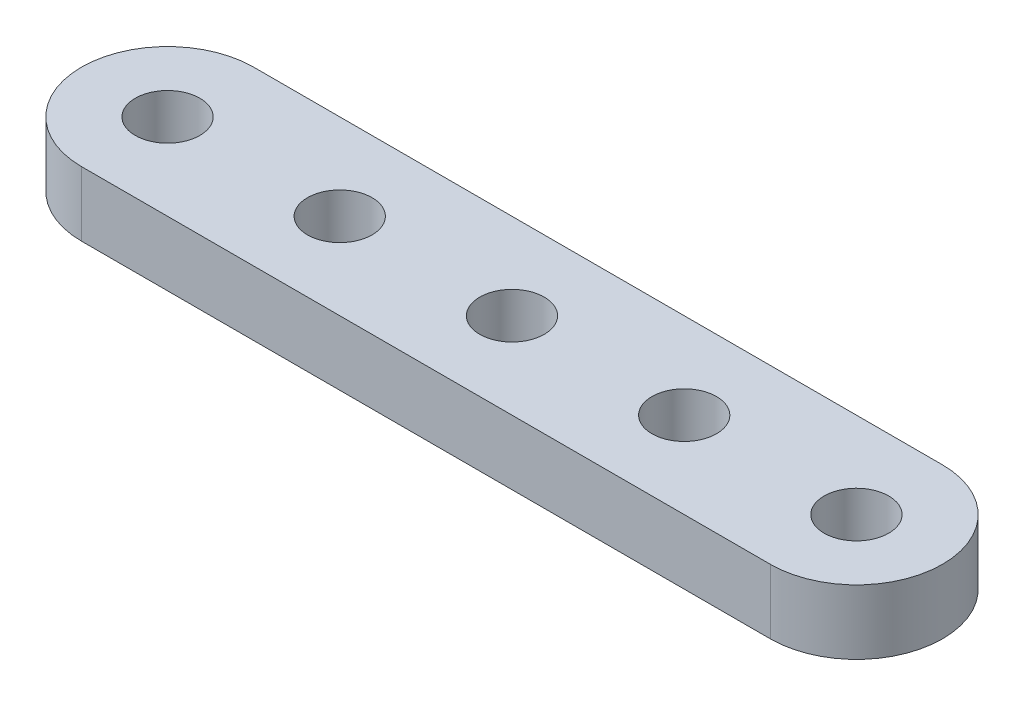
ISO-10303-21;
HEADER;
FILE_DESCRIPTION(('STEP AP214'),'2;1');
FILE_NAME('part.step','',(''),(''),'','','');
FILE_SCHEMA(('AUTOMOTIVE_DESIGN { 1 0 10303 214 1 1 1 1 }'));
ENDSEC;
DATA;
#1=APPLICATION_CONTEXT('core data for automotive mechanical design processes');
#2=APPLICATION_PROTOCOL_DEFINITION('international standard','automotive_design',2000,#1);
#3=PRODUCT_CONTEXT('',#1,'mechanical');
#4=PRODUCT('Part','Part','',(#3));
#5=PRODUCT_RELATED_PRODUCT_CATEGORY('part','',(#4));
#6=PRODUCT_DEFINITION_FORMATION('','',#4);
#7=PRODUCT_DEFINITION_CONTEXT('part definition',#1,'design');
#8=PRODUCT_DEFINITION('design','',#6,#7);
#9=PRODUCT_DEFINITION_SHAPE('','',#8);
#10=(LENGTH_UNIT() NAMED_UNIT(*) SI_UNIT(.MILLI.,.METRE.));
#11=(NAMED_UNIT(*) PLANE_ANGLE_UNIT() SI_UNIT($,.RADIAN.));
#12=(NAMED_UNIT(*) SI_UNIT($,.STERADIAN.) SOLID_ANGLE_UNIT());
#13=UNCERTAINTY_MEASURE_WITH_UNIT(LENGTH_MEASURE(1.E-05),#10,'distance_accuracy_value','');
#14=(GEOMETRIC_REPRESENTATION_CONTEXT(3) GLOBAL_UNCERTAINTY_ASSIGNED_CONTEXT((#13)) GLOBAL_UNIT_ASSIGNED_CONTEXT((#10,
#11,#12)) REPRESENTATION_CONTEXT('',''));
#15=CARTESIAN_POINT('',(0.,0.,0.));
#16=DIRECTION('',(0.,0.,1.));
#17=DIRECTION('',(1.,0.,0.));
#18=AXIS2_PLACEMENT_3D('',#15,#16,#17);
#19=CARTESIAN_POINT('',(0.,3.,0.));
#20=DIRECTION('',(0.,1.,0.));
#21=DIRECTION('',(0.,0.,1.));
#22=AXIS2_PLACEMENT_3D('',#19,#20,#21);
#23=PLANE('',#22);
#24=CARTESIAN_POINT('',(24.,3.,0.));
#25=DIRECTION('',(0.,1.,0.));
#26=DIRECTION('',(0.,0.,1.));
#27=AXIS2_PLACEMENT_3D('',#24,#25,#26);
#28=CIRCLE('',#27,1.5);
#29=CARTESIAN_POINT('',(24.,3.,1.5));
#30=VERTEX_POINT('',#29);
#31=EDGE_CURVE('E128',#30,#30,#28,.T.);
#32=ORIENTED_EDGE('',*,*,#31,.F.);
#33=EDGE_LOOP('',(#32));
#34=FACE_BOUND('',#33,.T.);
#35=CARTESIAN_POINT('',(7.99999999999999,3.,0.));
#36=DIRECTION('',(0.,1.,0.));
#37=DIRECTION('',(0.,0.,1.));
#38=AXIS2_PLACEMENT_3D('',#35,#36,#37);
#39=CIRCLE('',#38,1.5);
#40=CARTESIAN_POINT('',(7.99999999999999,3.,1.5));
#41=VERTEX_POINT('',#40);
#42=EDGE_CURVE('E116',#41,#41,#39,.T.);
#43=ORIENTED_EDGE('',*,*,#42,.F.);
#44=EDGE_LOOP('',(#43));
#45=FACE_BOUND('',#44,.T.);
#46=CARTESIAN_POINT('',(0.,3.,0.));
#47=DIRECTION('',(0.,1.,0.));
#48=DIRECTION('',(0.,0.,1.));
#49=AXIS2_PLACEMENT_3D('',#46,#47,#48);
#50=CIRCLE('',#49,4.);
#51=CARTESIAN_POINT('',(0.,3.,-4.));
#52=VERTEX_POINT('',#51);
#53=CARTESIAN_POINT('',(0.,3.,4.));
#54=VERTEX_POINT('',#53);
#55=EDGE_CURVE('E86',#52,#54,#50,.T.);
#56=ORIENTED_EDGE('',*,*,#55,.T.);
#57=DIRECTION('',(1.,0.,0.));
#58=VECTOR('',#57,1.);
#59=CARTESIAN_POINT('',(0.,3.,4.));
#60=LINE('',#59,#58);
#61=CARTESIAN_POINT('',(32.,3.,4.));
#62=VERTEX_POINT('',#61);
#63=EDGE_CURVE('E81',#54,#62,#60,.T.);
#64=ORIENTED_EDGE('',*,*,#63,.T.);
#65=CARTESIAN_POINT('',(32.,3.,0.));
#66=DIRECTION('',(0.,1.,0.));
#67=DIRECTION('',(0.,0.,1.));
#68=AXIS2_PLACEMENT_3D('',#65,#66,#67);
#69=CIRCLE('',#68,4.);
#70=CARTESIAN_POINT('',(32.,3.,-4.));
#71=VERTEX_POINT('',#70);
#72=EDGE_CURVE('E84',#62,#71,#69,.T.);
#73=ORIENTED_EDGE('',*,*,#72,.T.);
#74=DIRECTION('',(-1.,0.,0.));
#75=VECTOR('',#74,1.);
#76=CARTESIAN_POINT('',(0.,3.,-4.));
#77=LINE('',#76,#75);
#78=EDGE_CURVE('E51',#71,#52,#77,.T.);
#79=ORIENTED_EDGE('',*,*,#78,.T.);
#80=EDGE_LOOP('',(#56,#64,#73,#79));
#81=FACE_BOUND('',#80,.T.);
#82=CARTESIAN_POINT('',(0.,3.,0.));
#83=DIRECTION('',(0.,1.,0.));
#84=DIRECTION('',(0.,0.,1.));
#85=AXIS2_PLACEMENT_3D('',#82,#83,#84);
#86=CIRCLE('',#85,1.5);
#87=CARTESIAN_POINT('',(0.,3.,1.5));
#88=VERTEX_POINT('',#87);
#89=EDGE_CURVE('E101',#88,#88,#86,.T.);
#90=ORIENTED_EDGE('',*,*,#89,.F.);
#91=EDGE_LOOP('',(#90));
#92=FACE_BOUND('',#91,.T.);
#93=CARTESIAN_POINT('',(16.,3.,0.));
#94=DIRECTION('',(0.,1.,0.));
#95=DIRECTION('',(0.,0.,1.));
#96=AXIS2_PLACEMENT_3D('',#93,#94,#95);
#97=CIRCLE('',#96,1.5);
#98=CARTESIAN_POINT('',(16.,3.,1.5));
#99=VERTEX_POINT('',#98);
#100=EDGE_CURVE('E122',#99,#99,#97,.T.);
#101=ORIENTED_EDGE('',*,*,#100,.F.);
#102=EDGE_LOOP('',(#101));
#103=FACE_BOUND('',#102,.T.);
#104=CARTESIAN_POINT('',(32.,3.,0.));
#105=DIRECTION('',(0.,1.,0.));
#106=DIRECTION('',(0.,0.,1.));
#107=AXIS2_PLACEMENT_3D('',#104,#105,#106);
#108=CIRCLE('',#107,1.5);
#109=CARTESIAN_POINT('',(32.,3.,1.5));
#110=VERTEX_POINT('',#109);
#111=EDGE_CURVE('E134',#110,#110,#108,.T.);
#112=ORIENTED_EDGE('',*,*,#111,.F.);
#113=EDGE_LOOP('',(#112));
#114=FACE_BOUND('',#113,.T.);
#115=ADVANCED_FACE('F34',(#34,#45,#81,#92,#103,#114),#23,.T.);
#116=CARTESIAN_POINT('',(0.,0.,0.));
#117=DIRECTION('',(0.,1.,0.));
#118=DIRECTION('',(0.,0.,1.));
#119=AXIS2_PLACEMENT_3D('',#116,#117,#118);
#120=PLANE('',#119);
#121=CARTESIAN_POINT('',(24.,0.,0.));
#122=DIRECTION('',(0.,1.,0.));
#123=DIRECTION('',(0.,0.,1.));
#124=AXIS2_PLACEMENT_3D('',#121,#122,#123);
#125=CIRCLE('',#124,1.5);
#126=CARTESIAN_POINT('',(24.,0.,1.5));
#127=VERTEX_POINT('',#126);
#128=EDGE_CURVE('E131',#127,#127,#125,.T.);
#129=ORIENTED_EDGE('',*,*,#128,.T.);
#130=EDGE_LOOP('',(#129));
#131=FACE_BOUND('',#130,.T.);
#132=CARTESIAN_POINT('',(7.99999999999999,0.,0.));
#133=DIRECTION('',(0.,1.,0.));
#134=DIRECTION('',(0.,0.,1.));
#135=AXIS2_PLACEMENT_3D('',#132,#133,#134);
#136=CIRCLE('',#135,1.5);
#137=CARTESIAN_POINT('',(7.99999999999999,0.,1.5));
#138=VERTEX_POINT('',#137);
#139=EDGE_CURVE('E119',#138,#138,#136,.T.);
#140=ORIENTED_EDGE('',*,*,#139,.T.);
#141=EDGE_LOOP('',(#140));
#142=FACE_BOUND('',#141,.T.);
#143=CARTESIAN_POINT('',(0.,0.,0.));
#144=DIRECTION('',(0.,1.,0.));
#145=DIRECTION('',(0.,0.,1.));
#146=AXIS2_PLACEMENT_3D('',#143,#144,#145);
#147=CIRCLE('',#146,4.);
#148=CARTESIAN_POINT('',(0.,0.,-4.));
#149=VERTEX_POINT('',#148);
#150=CARTESIAN_POINT('',(0.,0.,4.));
#151=VERTEX_POINT('',#150);
#152=EDGE_CURVE('E98',#149,#151,#147,.T.);
#153=ORIENTED_EDGE('',*,*,#152,.F.);
#154=DIRECTION('',(-1.,0.,0.));
#155=VECTOR('',#154,1.);
#156=CARTESIAN_POINT('',(0.,0.,-4.));
#157=LINE('',#156,#155);
#158=CARTESIAN_POINT('',(32.,0.,-4.));
#159=VERTEX_POINT('',#158);
#160=EDGE_CURVE('E74',#159,#149,#157,.T.);
#161=ORIENTED_EDGE('',*,*,#160,.F.);
#162=CARTESIAN_POINT('',(32.,0.,0.));
#163=DIRECTION('',(0.,1.,0.));
#164=DIRECTION('',(0.,0.,1.));
#165=AXIS2_PLACEMENT_3D('',#162,#163,#164);
#166=CIRCLE('',#165,4.);
#167=CARTESIAN_POINT('',(32.,0.,4.));
#168=VERTEX_POINT('',#167);
#169=EDGE_CURVE('E68',#168,#159,#166,.T.);
#170=ORIENTED_EDGE('',*,*,#169,.F.);
#171=DIRECTION('',(1.,0.,0.));
#172=VECTOR('',#171,1.);
#173=CARTESIAN_POINT('',(0.,0.,4.));
#174=LINE('',#173,#172);
#175=EDGE_CURVE('E90',#151,#168,#174,.T.);
#176=ORIENTED_EDGE('',*,*,#175,.F.);
#177=EDGE_LOOP('',(#153,#161,#170,#176));
#178=FACE_BOUND('',#177,.T.);
#179=CARTESIAN_POINT('',(0.,0.,0.));
#180=DIRECTION('',(0.,1.,0.));
#181=DIRECTION('',(0.,0.,1.));
#182=AXIS2_PLACEMENT_3D('',#179,#180,#181);
#183=CIRCLE('',#182,1.5);
#184=CARTESIAN_POINT('',(0.,0.,1.5));
#185=VERTEX_POINT('',#184);
#186=EDGE_CURVE('E113',#185,#185,#183,.T.);
#187=ORIENTED_EDGE('',*,*,#186,.T.);
#188=EDGE_LOOP('',(#187));
#189=FACE_BOUND('',#188,.T.);
#190=CARTESIAN_POINT('',(16.,0.,0.));
#191=DIRECTION('',(0.,1.,0.));
#192=DIRECTION('',(0.,0.,1.));
#193=AXIS2_PLACEMENT_3D('',#190,#191,#192);
#194=CIRCLE('',#193,1.5);
#195=CARTESIAN_POINT('',(16.,0.,1.5));
#196=VERTEX_POINT('',#195);
#197=EDGE_CURVE('E125',#196,#196,#194,.T.);
#198=ORIENTED_EDGE('',*,*,#197,.T.);
#199=EDGE_LOOP('',(#198));
#200=FACE_BOUND('',#199,.T.);
#201=CARTESIAN_POINT('',(32.,0.,0.));
#202=DIRECTION('',(0.,1.,0.));
#203=DIRECTION('',(0.,0.,1.));
#204=AXIS2_PLACEMENT_3D('',#201,#202,#203);
#205=CIRCLE('',#204,1.5);
#206=CARTESIAN_POINT('',(32.,0.,1.5));
#207=VERTEX_POINT('',#206);
#208=EDGE_CURVE('E137',#207,#207,#205,.T.);
#209=ORIENTED_EDGE('',*,*,#208,.T.);
#210=EDGE_LOOP('',(#209));
#211=FACE_BOUND('',#210,.T.);
#212=ADVANCED_FACE('F109',(#131,#142,#178,#189,#200,#211),#120,.F.);
#213=CARTESIAN_POINT('',(0.,3.,0.));
#214=DIRECTION('',(0.,-1.,0.));
#215=DIRECTION('',(0.,0.,-1.));
#216=AXIS2_PLACEMENT_3D('',#213,#214,#215);
#217=CYLINDRICAL_SURFACE('',#216,4.);
#218=ORIENTED_EDGE('',*,*,#152,.T.);
#219=DIRECTION('',(0.,-1.,0.));
#220=VECTOR('',#219,1.);
#221=CARTESIAN_POINT('',(0.,3.,4.));
#222=LINE('',#221,#220);
#223=EDGE_CURVE('E11',#54,#151,#222,.T.);
#224=ORIENTED_EDGE('',*,*,#223,.F.);
#225=ORIENTED_EDGE('',*,*,#55,.F.);
#226=DIRECTION('',(0.,-1.,0.));
#227=VECTOR('',#226,1.);
#228=CARTESIAN_POINT('',(0.,3.,-4.));
#229=LINE('',#228,#227);
#230=EDGE_CURVE('E94',#52,#149,#229,.T.);
#231=ORIENTED_EDGE('',*,*,#230,.T.);
#232=EDGE_LOOP('',(#218,#224,#225,#231));
#233=FACE_BOUND('',#232,.T.);
#234=ADVANCED_FACE('F36',(#233),#217,.T.);
#235=CARTESIAN_POINT('',(0.,3.,4.));
#236=DIRECTION('',(0.,0.,-1.));
#237=DIRECTION('',(-1.,0.,0.));
#238=AXIS2_PLACEMENT_3D('',#235,#236,#237);
#239=PLANE('',#238);
#240=ORIENTED_EDGE('',*,*,#175,.T.);
#241=DIRECTION('',(0.,-1.,0.));
#242=VECTOR('',#241,1.);
#243=CARTESIAN_POINT('',(32.,3.,4.));
#244=LINE('',#243,#242);
#245=EDGE_CURVE('E43',#62,#168,#244,.T.);
#246=ORIENTED_EDGE('',*,*,#245,.F.);
#247=ORIENTED_EDGE('',*,*,#63,.F.);
#248=ORIENTED_EDGE('',*,*,#223,.T.);
#249=EDGE_LOOP('',(#240,#246,#247,#248));
#250=FACE_BOUND('',#249,.T.);
#251=ADVANCED_FACE('F89',(#250),#239,.F.);
#252=CARTESIAN_POINT('',(32.,3.,0.));
#253=DIRECTION('',(0.,-1.,0.));
#254=DIRECTION('',(0.,0.,-1.));
#255=AXIS2_PLACEMENT_3D('',#252,#253,#254);
#256=CYLINDRICAL_SURFACE('',#255,4.);
#257=ORIENTED_EDGE('',*,*,#169,.T.);
#258=DIRECTION('',(0.,-1.,0.));
#259=VECTOR('',#258,1.);
#260=CARTESIAN_POINT('',(32.,3.,-4.));
#261=LINE('',#260,#259);
#262=EDGE_CURVE('E91',#71,#159,#261,.T.);
#263=ORIENTED_EDGE('',*,*,#262,.F.);
#264=ORIENTED_EDGE('',*,*,#72,.F.);
#265=ORIENTED_EDGE('',*,*,#245,.T.);
#266=EDGE_LOOP('',(#257,#263,#264,#265));
#267=FACE_BOUND('',#266,.T.);
#268=ADVANCED_FACE('F92',(#267),#256,.T.);
#269=CARTESIAN_POINT('',(0.,3.,-4.));
#270=DIRECTION('',(0.,0.,1.));
#271=DIRECTION('',(1.,0.,0.));
#272=AXIS2_PLACEMENT_3D('',#269,#270,#271);
#273=PLANE('',#272);
#274=ORIENTED_EDGE('',*,*,#160,.T.);
#275=ORIENTED_EDGE('',*,*,#230,.F.);
#276=ORIENTED_EDGE('',*,*,#78,.F.);
#277=ORIENTED_EDGE('',*,*,#262,.T.);
#278=EDGE_LOOP('',(#274,#275,#276,#277));
#279=FACE_BOUND('',#278,.T.);
#280=ADVANCED_FACE('F106',(#279),#273,.F.);
#281=CARTESIAN_POINT('',(0.,3.,0.));
#282=DIRECTION('',(0.,-1.,0.));
#283=DIRECTION('',(0.,0.,-1.));
#284=AXIS2_PLACEMENT_3D('',#281,#282,#283);
#285=CYLINDRICAL_SURFACE('',#284,1.5);
#286=ORIENTED_EDGE('',*,*,#89,.T.);
#287=EDGE_LOOP('',(#286));
#288=FACE_BOUND('',#287,.T.);
#289=ORIENTED_EDGE('',*,*,#186,.F.);
#290=EDGE_LOOP('',(#289));
#291=FACE_BOUND('',#290,.T.);
#292=ADVANCED_FACE('F157',(#288,#291),#285,.F.);
#293=CARTESIAN_POINT('',(7.99999999999999,3.,0.));
#294=DIRECTION('',(0.,-1.,0.));
#295=DIRECTION('',(0.,0.,-1.));
#296=AXIS2_PLACEMENT_3D('',#293,#294,#295);
#297=CYLINDRICAL_SURFACE('',#296,1.5);
#298=ORIENTED_EDGE('',*,*,#42,.T.);
#299=EDGE_LOOP('',(#298));
#300=FACE_BOUND('',#299,.T.);
#301=ORIENTED_EDGE('',*,*,#139,.F.);
#302=EDGE_LOOP('',(#301));
#303=FACE_BOUND('',#302,.T.);
#304=ADVANCED_FACE('F203',(#300,#303),#297,.F.);
#305=CARTESIAN_POINT('',(16.,3.,0.));
#306=DIRECTION('',(0.,-1.,0.));
#307=DIRECTION('',(0.,0.,-1.));
#308=AXIS2_PLACEMENT_3D('',#305,#306,#307);
#309=CYLINDRICAL_SURFACE('',#308,1.5);
#310=ORIENTED_EDGE('',*,*,#100,.T.);
#311=EDGE_LOOP('',(#310));
#312=FACE_BOUND('',#311,.T.);
#313=ORIENTED_EDGE('',*,*,#197,.F.);
#314=EDGE_LOOP('',(#313));
#315=FACE_BOUND('',#314,.T.);
#316=ADVANCED_FACE('F211',(#312,#315),#309,.F.);
#317=CARTESIAN_POINT('',(24.,3.,0.));
#318=DIRECTION('',(0.,-1.,0.));
#319=DIRECTION('',(0.,0.,-1.));
#320=AXIS2_PLACEMENT_3D('',#317,#318,#319);
#321=CYLINDRICAL_SURFACE('',#320,1.5);
#322=ORIENTED_EDGE('',*,*,#31,.T.);
#323=EDGE_LOOP('',(#322));
#324=FACE_BOUND('',#323,.T.);
#325=ORIENTED_EDGE('',*,*,#128,.F.);
#326=EDGE_LOOP('',(#325));
#327=FACE_BOUND('',#326,.T.);
#328=ADVANCED_FACE('F219',(#324,#327),#321,.F.);
#329=CARTESIAN_POINT('',(32.,3.,0.));
#330=DIRECTION('',(0.,-1.,0.));
#331=DIRECTION('',(0.,0.,-1.));
#332=AXIS2_PLACEMENT_3D('',#329,#330,#331);
#333=CYLINDRICAL_SURFACE('',#332,1.5);
#334=ORIENTED_EDGE('',*,*,#111,.T.);
#335=EDGE_LOOP('',(#334));
#336=FACE_BOUND('',#335,.T.);
#337=ORIENTED_EDGE('',*,*,#208,.F.);
#338=EDGE_LOOP('',(#337));
#339=FACE_BOUND('',#338,.T.);
#340=ADVANCED_FACE('F143',(#336,#339),#333,.F.);
#341=CLOSED_SHELL('',(#115,#212,#234,#251,#268,#280,#292,#304,#316,#328,#340));
#342=MANIFOLD_SOLID_BREP('B2',#341);
#343=ADVANCED_BREP_SHAPE_REPRESENTATION('',(#18,#342),#14);
#344=SHAPE_DEFINITION_REPRESENTATION(#9,#343);
ENDSEC;
END-ISO-10303-21;
